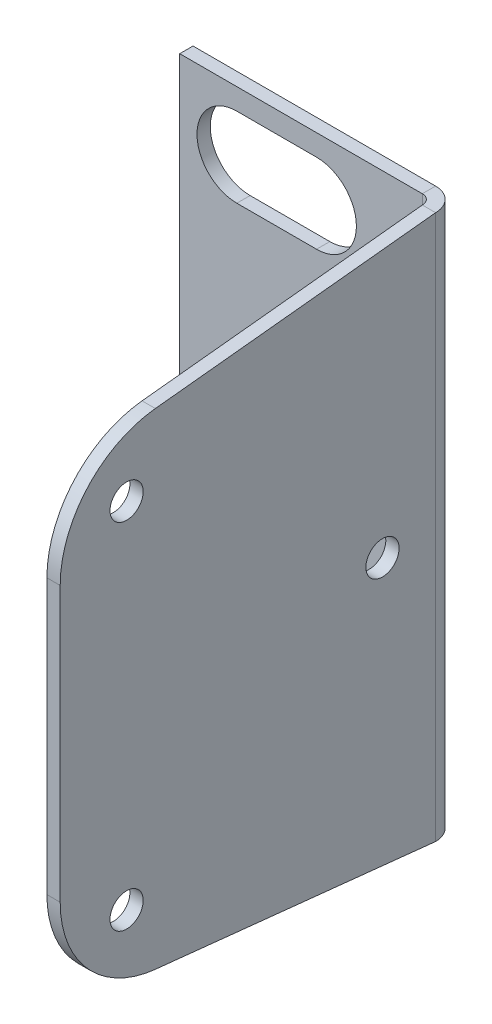
ISO-10303-21;
HEADER;
FILE_DESCRIPTION(('STEP AP214'),'2;1');
FILE_NAME('part.step','',(''),(''),'','','');
FILE_SCHEMA(('AUTOMOTIVE_DESIGN { 1 0 10303 214 1 1 1 1 }'));
ENDSEC;
DATA;
#1=APPLICATION_CONTEXT('core data for automotive mechanical design processes');
#2=APPLICATION_PROTOCOL_DEFINITION('international standard','automotive_design',2000,#1);
#3=PRODUCT_CONTEXT('',#1,'mechanical');
#4=PRODUCT('Part','Part','',(#3));
#5=PRODUCT_RELATED_PRODUCT_CATEGORY('part','',(#4));
#6=PRODUCT_DEFINITION_FORMATION('','',#4);
#7=PRODUCT_DEFINITION_CONTEXT('part definition',#1,'design');
#8=PRODUCT_DEFINITION('design','',#6,#7);
#9=PRODUCT_DEFINITION_SHAPE('','',#8);
#10=(LENGTH_UNIT() NAMED_UNIT(*) SI_UNIT(.MILLI.,.METRE.));
#11=(NAMED_UNIT(*) PLANE_ANGLE_UNIT() SI_UNIT($,.RADIAN.));
#12=(NAMED_UNIT(*) SI_UNIT($,.STERADIAN.) SOLID_ANGLE_UNIT());
#13=UNCERTAINTY_MEASURE_WITH_UNIT(LENGTH_MEASURE(1.E-05),#10,'distance_accuracy_value','');
#14=(GEOMETRIC_REPRESENTATION_CONTEXT(3) GLOBAL_UNCERTAINTY_ASSIGNED_CONTEXT((#13)) GLOBAL_UNIT_ASSIGNED_CONTEXT((#10,
#11,#12)) REPRESENTATION_CONTEXT('',''));
#15=CARTESIAN_POINT('',(0.,0.,0.));
#16=DIRECTION('',(0.,0.,1.));
#17=DIRECTION('',(1.,0.,0.));
#18=AXIS2_PLACEMENT_3D('',#15,#16,#17);
#19=CARTESIAN_POINT('',(-219.800000000025,0.,8.37981004221973E-13));
#20=DIRECTION('',(-1.,0.,0.));
#21=DIRECTION('',(0.,0.,1.));
#22=AXIS2_PLACEMENT_3D('',#19,#20,#21);
#23=PLANE('',#22);
#24=CARTESIAN_POINT('',(-219.800000000025,0.,5.7366));
#25=DIRECTION('',(-1.,0.,0.));
#26=DIRECTION('',(0.,0.,1.));
#27=AXIS2_PLACEMENT_3D('',#24,#25,#26);
#28=CIRCLE('',#27,1.25);
#29=CARTESIAN_POINT('',(-219.800000000025,0.,6.9866));
#30=VERTEX_POINT('',#29);
#31=EDGE_CURVE('E472',#30,#30,#28,.T.);
#32=ORIENTED_EDGE('',*,*,#31,.T.);
#33=EDGE_LOOP('',(#32));
#34=FACE_BOUND('',#33,.T.);
#35=CARTESIAN_POINT('',(-219.800000000024,13.3261646026093,25.));
#36=DIRECTION('',(-1.,0.,0.));
#37=DIRECTION('',(0.,0.,1.));
#38=AXIS2_PLACEMENT_3D('',#35,#36,#37);
#39=CIRCLE('',#38,1.25);
#40=CARTESIAN_POINT('',(-219.800000000024,13.3261646026093,26.25));
#41=VERTEX_POINT('',#40);
#42=EDGE_CURVE('E482',#41,#41,#39,.T.);
#43=ORIENTED_EDGE('',*,*,#42,.T.);
#44=EDGE_LOOP('',(#43));
#45=FACE_BOUND('',#44,.T.);
#46=CARTESIAN_POINT('',(-219.800000000024,-13.3261646026093,25.));
#47=DIRECTION('',(-1.,0.,0.));
#48=DIRECTION('',(0.,0.,1.));
#49=AXIS2_PLACEMENT_3D('',#46,#47,#48);
#50=CIRCLE('',#49,1.25);
#51=CARTESIAN_POINT('',(-219.800000000024,-13.3261646026093,26.25));
#52=VERTEX_POINT('',#51);
#53=EDGE_CURVE('E215',#52,#52,#50,.T.);
#54=ORIENTED_EDGE('',*,*,#53,.T.);
#55=EDGE_LOOP('',(#54));
#56=FACE_BOUND('',#55,.T.);
#57=DIRECTION('',(0.,-0.104528463267654,0.994521895368273));
#58=VECTOR('',#57,1.);
#59=CARTESIAN_POINT('',(-219.800000000025,20.4999999999999,1.7366));
#60=LINE('',#59,#58);
#61=CARTESIAN_POINT('',(-219.800000000025,20.4999999999999,1.7366));
#62=VERTEX_POINT('',#61);
#63=CARTESIAN_POINT('',(-219.800000000025,18.2823397655555,22.8362277061412));
#64=VERTEX_POINT('',#63);
#65=EDGE_CURVE('E298',#62,#64,#60,.T.);
#66=ORIENTED_EDGE('',*,*,#65,.T.);
#67=CARTESIAN_POINT('',(-219.800000000025,10.3261646026093,22.));
#68=DIRECTION('',(-1.,0.,0.));
#69=DIRECTION('',(0.,0.,1.));
#70=AXIS2_PLACEMENT_3D('',#67,#68,#69);
#71=CIRCLE('',#70,8.);
#72=CARTESIAN_POINT('',(-219.800000000025,10.3261646026093,30.));
#73=VERTEX_POINT('',#72);
#74=EDGE_CURVE('E287',#64,#73,#71,.F.);
#75=ORIENTED_EDGE('',*,*,#74,.T.);
#76=DIRECTION('',(0.,-1.,0.));
#77=VECTOR('',#76,1.);
#78=CARTESIAN_POINT('',(-219.800000000025,0.,30.));
#79=LINE('',#78,#77);
#80=CARTESIAN_POINT('',(-219.800000000025,-10.3261646026093,30.));
#81=VERTEX_POINT('',#80);
#82=EDGE_CURVE('E309',#73,#81,#79,.T.);
#83=ORIENTED_EDGE('',*,*,#82,.T.);
#84=CARTESIAN_POINT('',(-219.800000000025,-10.3261646026093,22.));
#85=DIRECTION('',(1.,0.,0.));
#86=DIRECTION('',(0.,0.,1.));
#87=AXIS2_PLACEMENT_3D('',#84,#85,#86);
#88=CIRCLE('',#87,8.);
#89=CARTESIAN_POINT('',(-219.800000000025,-18.2823397655554,22.8362277061412));
#90=VERTEX_POINT('',#89);
#91=EDGE_CURVE('E223',#90,#81,#88,.F.);
#92=ORIENTED_EDGE('',*,*,#91,.F.);
#93=DIRECTION('',(0.,0.104528463267654,0.994521895368273));
#94=VECTOR('',#93,1.);
#95=CARTESIAN_POINT('',(-219.800000000025,-20.4999999999999,1.7366));
#96=LINE('',#95,#94);
#97=CARTESIAN_POINT('',(-219.800000000025,-20.4999999999999,1.7366));
#98=VERTEX_POINT('',#97);
#99=EDGE_CURVE('E234',#98,#90,#96,.T.);
#100=ORIENTED_EDGE('',*,*,#99,.F.);
#101=DIRECTION('',(0.,1.,0.));
#102=VECTOR('',#101,1.);
#103=CARTESIAN_POINT('',(-219.800000000025,0.,1.7366));
#104=LINE('',#103,#102);
#105=EDGE_CURVE('E314',#62,#98,#104,.F.);
#106=ORIENTED_EDGE('',*,*,#105,.F.);
#107=EDGE_LOOP('',(#66,#75,#83,#92,#100,#106));
#108=FACE_BOUND('',#107,.T.);
#109=ADVANCED_FACE('F57',(#34,#45,#56,#108),#23,.F.);
#110=CARTESIAN_POINT('',(-220.800000000025,0.,8.41472485560817E-13));
#111=DIRECTION('',(-1.,0.,0.));
#112=DIRECTION('',(0.,0.,1.));
#113=AXIS2_PLACEMENT_3D('',#110,#111,#112);
#114=PLANE('',#113);
#115=CARTESIAN_POINT('',(-220.800000000025,0.,5.7366));
#116=DIRECTION('',(-1.,0.,0.));
#117=DIRECTION('',(0.,0.,1.));
#118=AXIS2_PLACEMENT_3D('',#115,#116,#117);
#119=CIRCLE('',#118,1.24999999999999);
#120=CARTESIAN_POINT('',(-220.800000000025,0.,6.98659999999999));
#121=VERTEX_POINT('',#120);
#122=EDGE_CURVE('E475',#121,#121,#119,.T.);
#123=ORIENTED_EDGE('',*,*,#122,.F.);
#124=EDGE_LOOP('',(#123));
#125=FACE_BOUND('',#124,.T.);
#126=CARTESIAN_POINT('',(-220.800000000025,13.3261646026093,25.));
#127=DIRECTION('',(-1.,0.,0.));
#128=DIRECTION('',(0.,0.,1.));
#129=AXIS2_PLACEMENT_3D('',#126,#127,#128);
#130=CIRCLE('',#129,1.24999999999999);
#131=CARTESIAN_POINT('',(-220.800000000025,13.3261646026093,26.25));
#132=VERTEX_POINT('',#131);
#133=EDGE_CURVE('E477',#132,#132,#130,.T.);
#134=ORIENTED_EDGE('',*,*,#133,.F.);
#135=EDGE_LOOP('',(#134));
#136=FACE_BOUND('',#135,.T.);
#137=CARTESIAN_POINT('',(-220.800000000025,-13.3261646026093,25.));
#138=DIRECTION('',(-1.,0.,0.));
#139=DIRECTION('',(0.,0.,1.));
#140=AXIS2_PLACEMENT_3D('',#137,#138,#139);
#141=CIRCLE('',#140,1.24999999999999);
#142=CARTESIAN_POINT('',(-220.800000000025,-13.3261646026093,26.25));
#143=VERTEX_POINT('',#142);
#144=EDGE_CURVE('E485',#143,#143,#141,.T.);
#145=ORIENTED_EDGE('',*,*,#144,.F.);
#146=EDGE_LOOP('',(#145));
#147=FACE_BOUND('',#146,.T.);
#148=CARTESIAN_POINT('',(-220.800000000025,10.3261646026093,22.));
#149=DIRECTION('',(-1.,0.,0.));
#150=DIRECTION('',(0.,0.,1.));
#151=AXIS2_PLACEMENT_3D('',#148,#149,#150);
#152=CIRCLE('',#151,8.);
#153=CARTESIAN_POINT('',(-220.800000000025,18.2823397655555,22.8362277061412));
#154=VERTEX_POINT('',#153);
#155=CARTESIAN_POINT('',(-220.800000000025,10.3261646026093,30.));
#156=VERTEX_POINT('',#155);
#157=EDGE_CURVE('E296',#154,#156,#152,.F.);
#158=ORIENTED_EDGE('',*,*,#157,.F.);
#159=DIRECTION('',(0.,-0.104528463267654,0.994521895368273));
#160=VECTOR('',#159,1.);
#161=CARTESIAN_POINT('',(-220.800000000025,20.4999999999999,1.7366));
#162=LINE('',#161,#160);
#163=CARTESIAN_POINT('',(-220.800000000025,20.4999999999999,1.7366));
#164=VERTEX_POINT('',#163);
#165=EDGE_CURVE('E293',#164,#154,#162,.T.);
#166=ORIENTED_EDGE('',*,*,#165,.F.);
#167=DIRECTION('',(0.,1.,0.));
#168=VECTOR('',#167,1.);
#169=CARTESIAN_POINT('',(-220.800000000025,0.,1.7366));
#170=LINE('',#169,#168);
#171=CARTESIAN_POINT('',(-220.800000000025,-20.4999999999999,1.7366));
#172=VERTEX_POINT('',#171);
#173=EDGE_CURVE('E306',#172,#164,#170,.T.);
#174=ORIENTED_EDGE('',*,*,#173,.F.);
#175=DIRECTION('',(0.,0.104528463267654,0.994521895368273));
#176=VECTOR('',#175,1.);
#177=CARTESIAN_POINT('',(-220.800000000025,-20.4999999999999,1.7366));
#178=LINE('',#177,#176);
#179=CARTESIAN_POINT('',(-220.800000000025,-18.2823397655554,22.8362277061412));
#180=VERTEX_POINT('',#179);
#181=EDGE_CURVE('E227',#172,#180,#178,.T.);
#182=ORIENTED_EDGE('',*,*,#181,.T.);
#183=CARTESIAN_POINT('',(-220.800000000025,-10.3261646026093,22.));
#184=DIRECTION('',(1.,0.,0.));
#185=DIRECTION('',(0.,0.,1.));
#186=AXIS2_PLACEMENT_3D('',#183,#184,#185);
#187=CIRCLE('',#186,8.);
#188=CARTESIAN_POINT('',(-220.800000000025,-10.3261646026093,30.));
#189=VERTEX_POINT('',#188);
#190=EDGE_CURVE('E231',#180,#189,#187,.F.);
#191=ORIENTED_EDGE('',*,*,#190,.T.);
#192=DIRECTION('',(0.,1.,0.));
#193=VECTOR('',#192,1.);
#194=CARTESIAN_POINT('',(-220.800000000025,0.,30.));
#195=LINE('',#194,#193);
#196=EDGE_CURVE('E312',#156,#189,#195,.F.);
#197=ORIENTED_EDGE('',*,*,#196,.F.);
#198=EDGE_LOOP('',(#158,#166,#174,#182,#191,#197));
#199=FACE_BOUND('',#198,.T.);
#200=ADVANCED_FACE('F369',(#125,#136,#147,#199),#114,.T.);
#201=CARTESIAN_POINT('',(-239.8,20.4999999999999,1.));
#202=DIRECTION('',(0.,-1.,0.));
#203=DIRECTION('',(0.,0.,-1.));
#204=AXIS2_PLACEMENT_3D('',#201,#202,#203);
#205=PLANE('',#204);
#206=DIRECTION('',(0.,0.,-1.));
#207=VECTOR('',#206,1.);
#208=CARTESIAN_POINT('',(-221.536600000025,20.4999999999999,1.));
#209=LINE('',#208,#207);
#210=CARTESIAN_POINT('',(-221.536600000025,20.4999999999999,1.));
#211=VERTEX_POINT('',#210);
#212=CARTESIAN_POINT('',(-221.536600000025,20.4999999999999,0.));
#213=VERTEX_POINT('',#212);
#214=EDGE_CURVE('E323',#211,#213,#209,.T.);
#215=ORIENTED_EDGE('',*,*,#214,.T.);
#216=DIRECTION('',(-1.,0.,0.));
#217=VECTOR('',#216,1.);
#218=CARTESIAN_POINT('',(-239.8,20.4999999999999,0.));
#219=LINE('',#218,#217);
#220=CARTESIAN_POINT('',(-239.8,20.4999999999999,0.));
#221=VERTEX_POINT('',#220);
#222=EDGE_CURVE('E335',#213,#221,#219,.T.);
#223=ORIENTED_EDGE('',*,*,#222,.T.);
#224=DIRECTION('',(0.,0.,-1.));
#225=VECTOR('',#224,1.);
#226=CARTESIAN_POINT('',(-239.8,20.4999999999999,1.));
#227=LINE('',#226,#225);
#228=CARTESIAN_POINT('',(-239.8,20.4999999999999,1.));
#229=VERTEX_POINT('',#228);
#230=EDGE_CURVE('E13',#229,#221,#227,.T.);
#231=ORIENTED_EDGE('',*,*,#230,.F.);
#232=DIRECTION('',(-1.,0.,0.));
#233=VECTOR('',#232,1.);
#234=CARTESIAN_POINT('',(-239.8,20.4999999999999,1.));
#235=LINE('',#234,#233);
#236=EDGE_CURVE('E65',#211,#229,#235,.T.);
#237=ORIENTED_EDGE('',*,*,#236,.F.);
#238=EDGE_LOOP('',(#215,#223,#231,#237));
#239=FACE_BOUND('',#238,.T.);
#240=ADVANCED_FACE('F340',(#239),#205,.F.);
#241=CARTESIAN_POINT('',(0.,0.,1.));
#242=DIRECTION('',(0.,0.,1.));
#243=DIRECTION('',(1.,0.,0.));
#244=AXIS2_PLACEMENT_3D('',#241,#242,#243);
#245=PLANE('',#244);
#246=CARTESIAN_POINT('',(-229.5,15.9,1.));
#247=DIRECTION('',(0.,0.,1.));
#248=DIRECTION('',(1.,0.,0.));
#249=AXIS2_PLACEMENT_3D('',#246,#247,#248);
#250=CIRCLE('',#249,3.);
#251=CARTESIAN_POINT('',(-229.5,12.9,1.));
#252=VERTEX_POINT('',#251);
#253=CARTESIAN_POINT('',(-229.5,18.9,1.));
#254=VERTEX_POINT('',#253);
#255=EDGE_CURVE('E72',#252,#254,#250,.T.);
#256=ORIENTED_EDGE('',*,*,#255,.F.);
#257=DIRECTION('',(1.,0.,0.));
#258=VECTOR('',#257,1.);
#259=CARTESIAN_POINT('',(-235.5,12.9,1.));
#260=LINE('',#259,#258);
#261=CARTESIAN_POINT('',(-235.5,12.9,1.));
#262=VERTEX_POINT('',#261);
#263=EDGE_CURVE('E268',#262,#252,#260,.T.);
#264=ORIENTED_EDGE('',*,*,#263,.F.);
#265=CARTESIAN_POINT('',(-235.5,15.9,1.));
#266=DIRECTION('',(0.,0.,1.));
#267=DIRECTION('',(1.,0.,0.));
#268=AXIS2_PLACEMENT_3D('',#265,#266,#267);
#269=CIRCLE('',#268,3.);
#270=CARTESIAN_POINT('',(-235.5,18.9,1.));
#271=VERTEX_POINT('',#270);
#272=EDGE_CURVE('E280',#271,#262,#269,.T.);
#273=ORIENTED_EDGE('',*,*,#272,.F.);
#274=DIRECTION('',(-1.,0.,0.));
#275=VECTOR('',#274,1.);
#276=CARTESIAN_POINT('',(-229.5,18.9,1.));
#277=LINE('',#276,#275);
#278=EDGE_CURVE('E277',#254,#271,#277,.T.);
#279=ORIENTED_EDGE('',*,*,#278,.F.);
#280=EDGE_LOOP('',(#256,#264,#273,#279));
#281=FACE_BOUND('',#280,.T.);
#282=DIRECTION('',(0.,-1.,0.));
#283=VECTOR('',#282,1.);
#284=CARTESIAN_POINT('',(-239.8,20.4999999999999,1.));
#285=LINE('',#284,#283);
#286=CARTESIAN_POINT('',(-239.8,-20.4999999999999,1.));
#287=VERTEX_POINT('',#286);
#288=EDGE_CURVE('E333',#229,#287,#285,.T.);
#289=ORIENTED_EDGE('',*,*,#288,.T.);
#290=DIRECTION('',(-1.,0.,0.));
#291=VECTOR('',#290,1.);
#292=CARTESIAN_POINT('',(-239.8,-20.4999999999999,1.));
#293=LINE('',#292,#291);
#294=CARTESIAN_POINT('',(-221.536600000025,-20.4999999999999,1.));
#295=VERTEX_POINT('',#294);
#296=EDGE_CURVE('E256',#295,#287,#293,.T.);
#297=ORIENTED_EDGE('',*,*,#296,.F.);
#298=DIRECTION('',(0.,1.,0.));
#299=VECTOR('',#298,1.);
#300=CARTESIAN_POINT('',(-221.536600000025,20.4999999999999,1.));
#301=LINE('',#300,#299);
#302=EDGE_CURVE('E327',#211,#295,#301,.F.);
#303=ORIENTED_EDGE('',*,*,#302,.F.);
#304=ORIENTED_EDGE('',*,*,#236,.T.);
#305=EDGE_LOOP('',(#289,#297,#303,#304));
#306=FACE_BOUND('',#305,.T.);
#307=CARTESIAN_POINT('',(-229.5,-15.8999999999999,1.));
#308=DIRECTION('',(0.,0.,-1.));
#309=DIRECTION('',(1.,0.,0.));
#310=AXIS2_PLACEMENT_3D('',#307,#308,#309);
#311=CIRCLE('',#310,3.);
#312=CARTESIAN_POINT('',(-229.5,-12.8999999999999,1.));
#313=VERTEX_POINT('',#312);
#314=CARTESIAN_POINT('',(-229.5,-18.8999999999999,1.));
#315=VERTEX_POINT('',#314);
#316=EDGE_CURVE('E213',#313,#315,#311,.T.);
#317=ORIENTED_EDGE('',*,*,#316,.T.);
#318=DIRECTION('',(-1.,0.,0.));
#319=VECTOR('',#318,1.);
#320=CARTESIAN_POINT('',(-229.5,-18.8999999999999,1.));
#321=LINE('',#320,#319);
#322=CARTESIAN_POINT('',(-235.5,-18.8999999999999,1.));
#323=VERTEX_POINT('',#322);
#324=EDGE_CURVE('E189',#315,#323,#321,.T.);
#325=ORIENTED_EDGE('',*,*,#324,.T.);
#326=CARTESIAN_POINT('',(-235.5,-15.8999999999999,1.));
#327=DIRECTION('',(0.,0.,-1.));
#328=DIRECTION('',(1.,0.,0.));
#329=AXIS2_PLACEMENT_3D('',#326,#327,#328);
#330=CIRCLE('',#329,3.);
#331=CARTESIAN_POINT('',(-235.5,-12.8999999999999,1.));
#332=VERTEX_POINT('',#331);
#333=EDGE_CURVE('E217',#323,#332,#330,.T.);
#334=ORIENTED_EDGE('',*,*,#333,.T.);
#335=DIRECTION('',(1.,0.,0.));
#336=VECTOR('',#335,1.);
#337=CARTESIAN_POINT('',(-235.5,-12.8999999999999,1.));
#338=LINE('',#337,#336);
#339=EDGE_CURVE('E203',#332,#313,#338,.T.);
#340=ORIENTED_EDGE('',*,*,#339,.T.);
#341=EDGE_LOOP('',(#317,#325,#334,#340));
#342=FACE_BOUND('',#341,.T.);
#343=ADVANCED_FACE('F355',(#281,#306,#342),#245,.T.);
#344=CARTESIAN_POINT('',(0.,0.,0.));
#345=DIRECTION('',(0.,0.,1.));
#346=DIRECTION('',(1.,0.,0.));
#347=AXIS2_PLACEMENT_3D('',#344,#345,#346);
#348=PLANE('',#347);
#349=DIRECTION('',(1.,0.,0.));
#350=VECTOR('',#349,1.);
#351=CARTESIAN_POINT('',(-235.5,12.9,0.));
#352=LINE('',#351,#350);
#353=CARTESIAN_POINT('',(-235.5,12.9,0.));
#354=VERTEX_POINT('',#353);
#355=CARTESIAN_POINT('',(-229.5,12.9,0.));
#356=VERTEX_POINT('',#355);
#357=EDGE_CURVE('E272',#354,#356,#352,.T.);
#358=ORIENTED_EDGE('',*,*,#357,.T.);
#359=CARTESIAN_POINT('',(-229.5,15.9,0.));
#360=DIRECTION('',(0.,0.,1.));
#361=DIRECTION('',(1.,0.,0.));
#362=AXIS2_PLACEMENT_3D('',#359,#360,#361);
#363=CIRCLE('',#362,3.);
#364=CARTESIAN_POINT('',(-229.5,18.9,0.));
#365=VERTEX_POINT('',#364);
#366=EDGE_CURVE('E264',#356,#365,#363,.T.);
#367=ORIENTED_EDGE('',*,*,#366,.T.);
#368=DIRECTION('',(-1.,0.,0.));
#369=VECTOR('',#368,1.);
#370=CARTESIAN_POINT('',(-229.5,18.9,0.));
#371=LINE('',#370,#369);
#372=CARTESIAN_POINT('',(-235.5,18.9,0.));
#373=VERTEX_POINT('',#372);
#374=EDGE_CURVE('E267',#365,#373,#371,.T.);
#375=ORIENTED_EDGE('',*,*,#374,.T.);
#376=CARTESIAN_POINT('',(-235.5,15.9,0.));
#377=DIRECTION('',(0.,0.,1.));
#378=DIRECTION('',(1.,0.,0.));
#379=AXIS2_PLACEMENT_3D('',#376,#377,#378);
#380=CIRCLE('',#379,3.);
#381=EDGE_CURVE('E80',#373,#354,#380,.T.);
#382=ORIENTED_EDGE('',*,*,#381,.T.);
#383=EDGE_LOOP('',(#358,#367,#375,#382));
#384=FACE_BOUND('',#383,.T.);
#385=DIRECTION('',(0.,1.,0.));
#386=VECTOR('',#385,1.);
#387=CARTESIAN_POINT('',(-221.536600000025,20.4999999999999,0.));
#388=LINE('',#387,#386);
#389=CARTESIAN_POINT('',(-221.536600000025,-20.4999999999999,0.));
#390=VERTEX_POINT('',#389);
#391=EDGE_CURVE('E321',#213,#390,#388,.F.);
#392=ORIENTED_EDGE('',*,*,#391,.T.);
#393=DIRECTION('',(-1.,0.,0.));
#394=VECTOR('',#393,1.);
#395=CARTESIAN_POINT('',(-239.8,-20.4999999999999,0.));
#396=LINE('',#395,#394);
#397=CARTESIAN_POINT('',(-239.8,-20.4999999999999,0.));
#398=VERTEX_POINT('',#397);
#399=EDGE_CURVE('E255',#390,#398,#396,.T.);
#400=ORIENTED_EDGE('',*,*,#399,.T.);
#401=DIRECTION('',(0.,-1.,0.));
#402=VECTOR('',#401,1.);
#403=CARTESIAN_POINT('',(-239.8,20.4999999999999,0.));
#404=LINE('',#403,#402);
#405=EDGE_CURVE('E332',#221,#398,#404,.T.);
#406=ORIENTED_EDGE('',*,*,#405,.F.);
#407=ORIENTED_EDGE('',*,*,#222,.F.);
#408=EDGE_LOOP('',(#392,#400,#406,#407));
#409=FACE_BOUND('',#408,.T.);
#410=DIRECTION('',(1.,0.,0.));
#411=VECTOR('',#410,1.);
#412=CARTESIAN_POINT('',(-235.5,-12.8999999999999,0.));
#413=LINE('',#412,#411);
#414=CARTESIAN_POINT('',(-235.5,-12.8999999999999,0.));
#415=VERTEX_POINT('',#414);
#416=CARTESIAN_POINT('',(-229.5,-12.8999999999999,0.));
#417=VERTEX_POINT('',#416);
#418=EDGE_CURVE('E194',#415,#417,#413,.T.);
#419=ORIENTED_EDGE('',*,*,#418,.F.);
#420=CARTESIAN_POINT('',(-235.5,-15.8999999999999,0.));
#421=DIRECTION('',(0.,0.,-1.));
#422=DIRECTION('',(1.,0.,0.));
#423=AXIS2_PLACEMENT_3D('',#420,#421,#422);
#424=CIRCLE('',#423,3.);
#425=CARTESIAN_POINT('',(-235.5,-18.8999999999999,0.));
#426=VERTEX_POINT('',#425);
#427=EDGE_CURVE('E207',#426,#415,#424,.T.);
#428=ORIENTED_EDGE('',*,*,#427,.F.);
#429=DIRECTION('',(-1.,0.,0.));
#430=VECTOR('',#429,1.);
#431=CARTESIAN_POINT('',(-229.5,-18.8999999999999,0.));
#432=LINE('',#431,#430);
#433=CARTESIAN_POINT('',(-229.5,-18.8999999999999,0.));
#434=VERTEX_POINT('',#433);
#435=EDGE_CURVE('E186',#434,#426,#432,.T.);
#436=ORIENTED_EDGE('',*,*,#435,.F.);
#437=CARTESIAN_POINT('',(-229.5,-15.8999999999999,0.));
#438=DIRECTION('',(0.,0.,-1.));
#439=DIRECTION('',(1.,0.,0.));
#440=AXIS2_PLACEMENT_3D('',#437,#438,#439);
#441=CIRCLE('',#440,3.);
#442=EDGE_CURVE('E197',#417,#434,#441,.T.);
#443=ORIENTED_EDGE('',*,*,#442,.F.);
#444=EDGE_LOOP('',(#419,#428,#436,#443));
#445=FACE_BOUND('',#444,.T.);
#446=ADVANCED_FACE('F205',(#384,#409,#445),#348,.F.);
#447=CARTESIAN_POINT('',(-239.8,20.4999999999999,1.));
#448=DIRECTION('',(1.,0.,0.));
#449=DIRECTION('',(0.,0.,-1.));
#450=AXIS2_PLACEMENT_3D('',#447,#448,#449);
#451=PLANE('',#450);
#452=ORIENTED_EDGE('',*,*,#405,.T.);
#453=DIRECTION('',(0.,0.,-1.));
#454=VECTOR('',#453,1.);
#455=CARTESIAN_POINT('',(-239.8,-20.4999999999999,1.));
#456=LINE('',#455,#454);
#457=EDGE_CURVE('E259',#287,#398,#456,.T.);
#458=ORIENTED_EDGE('',*,*,#457,.F.);
#459=ORIENTED_EDGE('',*,*,#288,.F.);
#460=ORIENTED_EDGE('',*,*,#230,.T.);
#461=EDGE_LOOP('',(#452,#458,#459,#460));
#462=FACE_BOUND('',#461,.T.);
#463=ADVANCED_FACE('F59',(#462),#451,.F.);
#464=CARTESIAN_POINT('',(-221.536600000025,20.4999999999999,1.73660000000001));
#465=DIRECTION('',(0.,-1.,0.));
#466=DIRECTION('',(0.,0.,-1.));
#467=AXIS2_PLACEMENT_3D('',#464,#465,#466);
#468=PLANE('',#467);
#469=CARTESIAN_POINT('',(-221.536600000025,20.4999999999999,1.73660000000001));
#470=DIRECTION('',(0.,1.,0.));
#471=DIRECTION('',(0.,0.,1.));
#472=AXIS2_PLACEMENT_3D('',#469,#470,#471);
#473=CIRCLE('',#472,0.736600000000004);
#474=EDGE_CURVE('E311',#164,#211,#473,.T.);
#475=ORIENTED_EDGE('',*,*,#474,.F.);
#476=DIRECTION('',(-1.,0.,0.));
#477=VECTOR('',#476,1.);
#478=CARTESIAN_POINT('',(-220.800000000025,20.4999999999999,1.7366));
#479=LINE('',#478,#477);
#480=EDGE_CURVE('E316',#164,#62,#479,.F.);
#481=ORIENTED_EDGE('',*,*,#480,.T.);
#482=CARTESIAN_POINT('',(-221.536600000025,20.4999999999999,1.73660000000001));
#483=DIRECTION('',(0.,1.,0.));
#484=DIRECTION('',(0.,0.,1.));
#485=AXIS2_PLACEMENT_3D('',#482,#483,#484);
#486=CIRCLE('',#485,1.7366);
#487=EDGE_CURVE('E324',#62,#213,#486,.T.);
#488=ORIENTED_EDGE('',*,*,#487,.T.);
#489=ORIENTED_EDGE('',*,*,#214,.F.);
#490=EDGE_LOOP('',(#475,#481,#488,#489));
#491=FACE_BOUND('',#490,.T.);
#492=ADVANCED_FACE('F359',(#491),#468,.F.);
#493=CARTESIAN_POINT('',(-221.536600000025,20.4999999999999,1.73660000000001));
#494=DIRECTION('',(0.,1.,0.));
#495=DIRECTION('',(1.,0.,0.));
#496=AXIS2_PLACEMENT_3D('',#493,#494,#495);
#497=CYLINDRICAL_SURFACE('',#496,1.7366);
#498=ORIENTED_EDGE('',*,*,#391,.F.);
#499=ORIENTED_EDGE('',*,*,#487,.F.);
#500=ORIENTED_EDGE('',*,*,#105,.T.);
#501=CARTESIAN_POINT('',(-221.536600000025,-20.4999999999999,1.73660000000001));
#502=DIRECTION('',(0.,1.,0.));
#503=DIRECTION('',(0.,0.,1.));
#504=AXIS2_PLACEMENT_3D('',#501,#502,#503);
#505=CIRCLE('',#504,1.7366);
#506=EDGE_CURVE('E247',#98,#390,#505,.T.);
#507=ORIENTED_EDGE('',*,*,#506,.T.);
#508=EDGE_LOOP('',(#498,#499,#500,#507));
#509=FACE_BOUND('',#508,.T.);
#510=ADVANCED_FACE('F393',(#509),#497,.T.);
#511=CARTESIAN_POINT('',(-221.536600000025,20.4999999999999,1.73660000000001));
#512=DIRECTION('',(0.,1.,0.));
#513=DIRECTION('',(1.,0.,0.));
#514=AXIS2_PLACEMENT_3D('',#511,#512,#513);
#515=CYLINDRICAL_SURFACE('',#514,0.736600000000004);
#516=ORIENTED_EDGE('',*,*,#302,.T.);
#517=CARTESIAN_POINT('',(-221.536600000025,-20.4999999999999,1.73660000000001));
#518=DIRECTION('',(0.,1.,0.));
#519=DIRECTION('',(0.,0.,1.));
#520=AXIS2_PLACEMENT_3D('',#517,#518,#519);
#521=CIRCLE('',#520,0.736600000000004);
#522=EDGE_CURVE('E246',#172,#295,#521,.T.);
#523=ORIENTED_EDGE('',*,*,#522,.F.);
#524=ORIENTED_EDGE('',*,*,#173,.T.);
#525=ORIENTED_EDGE('',*,*,#474,.T.);
#526=EDGE_LOOP('',(#516,#523,#524,#525));
#527=FACE_BOUND('',#526,.T.);
#528=ADVANCED_FACE('F362',(#527),#515,.F.);
#529=CARTESIAN_POINT('',(-219.800000000025,0.,30.));
#530=DIRECTION('',(0.,0.,-1.));
#531=DIRECTION('',(-1.,0.,0.));
#532=AXIS2_PLACEMENT_3D('',#529,#530,#531);
#533=PLANE('',#532);
#534=ORIENTED_EDGE('',*,*,#82,.F.);
#535=DIRECTION('',(1.,0.,0.));
#536=VECTOR('',#535,1.);
#537=CARTESIAN_POINT('',(-219.800000000025,10.3261646026093,30.));
#538=LINE('',#537,#536);
#539=EDGE_CURVE('E295',#73,#156,#538,.F.);
#540=ORIENTED_EDGE('',*,*,#539,.T.);
#541=ORIENTED_EDGE('',*,*,#196,.T.);
#542=DIRECTION('',(1.,0.,0.));
#543=VECTOR('',#542,1.);
#544=CARTESIAN_POINT('',(-219.800000000025,-10.3261646026093,30.));
#545=LINE('',#544,#543);
#546=EDGE_CURVE('E230',#81,#189,#545,.F.);
#547=ORIENTED_EDGE('',*,*,#546,.F.);
#548=EDGE_LOOP('',(#534,#540,#541,#547));
#549=FACE_BOUND('',#548,.T.);
#550=ADVANCED_FACE('F385',(#549),#533,.F.);
#551=CARTESIAN_POINT('',(-219.800000000025,20.4999999999999,1.7366));
#552=DIRECTION('',(0.,-0.994521895368273,-0.104528463267654));
#553=DIRECTION('',(0.,-0.104528463267654,0.994521895368273));
#554=AXIS2_PLACEMENT_3D('',#551,#552,#553);
#555=PLANE('',#554);
#556=DIRECTION('',(1.,0.,0.));
#557=VECTOR('',#556,1.);
#558=CARTESIAN_POINT('',(-219.800000000025,18.2823397655555,22.8362277061412));
#559=LINE('',#558,#557);
#560=EDGE_CURVE('E303',#64,#154,#559,.F.);
#561=ORIENTED_EDGE('',*,*,#560,.F.);
#562=ORIENTED_EDGE('',*,*,#65,.F.);
#563=ORIENTED_EDGE('',*,*,#480,.F.);
#564=ORIENTED_EDGE('',*,*,#165,.T.);
#565=EDGE_LOOP('',(#561,#562,#563,#564));
#566=FACE_BOUND('',#565,.T.);
#567=ADVANCED_FACE('F391',(#566),#555,.F.);
#568=CARTESIAN_POINT('',(-219.800000000025,10.3261646026093,22.));
#569=DIRECTION('',(-1.,0.,0.));
#570=DIRECTION('',(0.,0.,1.));
#571=AXIS2_PLACEMENT_3D('',#568,#569,#570);
#572=CYLINDRICAL_SURFACE('',#571,8.);
#573=ORIENTED_EDGE('',*,*,#74,.F.);
#574=ORIENTED_EDGE('',*,*,#560,.T.);
#575=ORIENTED_EDGE('',*,*,#157,.T.);
#576=ORIENTED_EDGE('',*,*,#539,.F.);
#577=EDGE_LOOP('',(#573,#574,#575,#576));
#578=FACE_BOUND('',#577,.T.);
#579=ADVANCED_FACE('F388',(#578),#572,.T.);
#580=CARTESIAN_POINT('',(-229.5,15.9,0.));
#581=DIRECTION('',(0.,0.,1.));
#582=DIRECTION('',(1.,0.,0.));
#583=AXIS2_PLACEMENT_3D('',#580,#581,#582);
#584=CYLINDRICAL_SURFACE('',#583,3.);
#585=ORIENTED_EDGE('',*,*,#255,.T.);
#586=DIRECTION('',(0.,0.,1.));
#587=VECTOR('',#586,1.);
#588=CARTESIAN_POINT('',(-229.5,18.9,0.));
#589=LINE('',#588,#587);
#590=EDGE_CURVE('E275',#365,#254,#589,.T.);
#591=ORIENTED_EDGE('',*,*,#590,.F.);
#592=ORIENTED_EDGE('',*,*,#366,.F.);
#593=DIRECTION('',(0.,0.,1.));
#594=VECTOR('',#593,1.);
#595=CARTESIAN_POINT('',(-229.5,12.9,0.));
#596=LINE('',#595,#594);
#597=EDGE_CURVE('E285',#356,#252,#596,.T.);
#598=ORIENTED_EDGE('',*,*,#597,.T.);
#599=EDGE_LOOP('',(#585,#591,#592,#598));
#600=FACE_BOUND('',#599,.T.);
#601=ADVANCED_FACE('F422',(#600),#584,.F.);
#602=CARTESIAN_POINT('',(-235.5,12.9,0.));
#603=DIRECTION('',(0.,-1.,0.));
#604=DIRECTION('',(1.,0.,0.));
#605=AXIS2_PLACEMENT_3D('',#602,#603,#604);
#606=PLANE('',#605);
#607=ORIENTED_EDGE('',*,*,#263,.T.);
#608=ORIENTED_EDGE('',*,*,#597,.F.);
#609=ORIENTED_EDGE('',*,*,#357,.F.);
#610=DIRECTION('',(0.,0.,1.));
#611=VECTOR('',#610,1.);
#612=CARTESIAN_POINT('',(-235.5,12.9,0.));
#613=LINE('',#612,#611);
#614=EDGE_CURVE('E288',#354,#262,#613,.T.);
#615=ORIENTED_EDGE('',*,*,#614,.T.);
#616=EDGE_LOOP('',(#607,#608,#609,#615));
#617=FACE_BOUND('',#616,.T.);
#618=ADVANCED_FACE('F426',(#617),#606,.F.);
#619=CARTESIAN_POINT('',(-235.5,15.9,0.));
#620=DIRECTION('',(0.,0.,1.));
#621=DIRECTION('',(1.,0.,0.));
#622=AXIS2_PLACEMENT_3D('',#619,#620,#621);
#623=CYLINDRICAL_SURFACE('',#622,3.);
#624=ORIENTED_EDGE('',*,*,#272,.T.);
#625=ORIENTED_EDGE('',*,*,#614,.F.);
#626=ORIENTED_EDGE('',*,*,#381,.F.);
#627=DIRECTION('',(0.,0.,1.));
#628=VECTOR('',#627,1.);
#629=CARTESIAN_POINT('',(-235.5,18.9,0.));
#630=LINE('',#629,#628);
#631=EDGE_CURVE('E290',#373,#271,#630,.T.);
#632=ORIENTED_EDGE('',*,*,#631,.T.);
#633=EDGE_LOOP('',(#624,#625,#626,#632));
#634=FACE_BOUND('',#633,.T.);
#635=ADVANCED_FACE('F430',(#634),#623,.F.);
#636=CARTESIAN_POINT('',(-229.5,18.9,0.));
#637=DIRECTION('',(0.,1.,0.));
#638=DIRECTION('',(-1.,0.,0.));
#639=AXIS2_PLACEMENT_3D('',#636,#637,#638);
#640=PLANE('',#639);
#641=ORIENTED_EDGE('',*,*,#278,.T.);
#642=ORIENTED_EDGE('',*,*,#631,.F.);
#643=ORIENTED_EDGE('',*,*,#374,.F.);
#644=ORIENTED_EDGE('',*,*,#590,.T.);
#645=EDGE_LOOP('',(#641,#642,#643,#644));
#646=FACE_BOUND('',#645,.T.);
#647=ADVANCED_FACE('F427',(#646),#640,.F.);
#648=CARTESIAN_POINT('',(-239.8,-20.4999999999999,1.));
#649=DIRECTION('',(0.,1.,0.));
#650=DIRECTION('',(0.,0.,-1.));
#651=AXIS2_PLACEMENT_3D('',#648,#649,#650);
#652=PLANE('',#651);
#653=DIRECTION('',(0.,0.,-1.));
#654=VECTOR('',#653,1.);
#655=CARTESIAN_POINT('',(-221.536600000025,-20.4999999999999,1.));
#656=LINE('',#655,#654);
#657=EDGE_CURVE('E250',#295,#390,#656,.T.);
#658=ORIENTED_EDGE('',*,*,#657,.F.);
#659=ORIENTED_EDGE('',*,*,#296,.T.);
#660=ORIENTED_EDGE('',*,*,#457,.T.);
#661=ORIENTED_EDGE('',*,*,#399,.F.);
#662=EDGE_LOOP('',(#658,#659,#660,#661));
#663=FACE_BOUND('',#662,.T.);
#664=ADVANCED_FACE('F352',(#663),#652,.F.);
#665=CARTESIAN_POINT('',(-221.536600000025,-20.4999999999999,1.73660000000001));
#666=DIRECTION('',(0.,1.,0.));
#667=DIRECTION('',(0.,0.,-1.));
#668=AXIS2_PLACEMENT_3D('',#665,#666,#667);
#669=PLANE('',#668);
#670=ORIENTED_EDGE('',*,*,#522,.T.);
#671=ORIENTED_EDGE('',*,*,#657,.T.);
#672=ORIENTED_EDGE('',*,*,#506,.F.);
#673=DIRECTION('',(-1.,0.,0.));
#674=VECTOR('',#673,1.);
#675=CARTESIAN_POINT('',(-220.800000000025,-20.4999999999999,1.7366));
#676=LINE('',#675,#674);
#677=EDGE_CURVE('E241',#172,#98,#676,.F.);
#678=ORIENTED_EDGE('',*,*,#677,.F.);
#679=EDGE_LOOP('',(#670,#671,#672,#678));
#680=FACE_BOUND('',#679,.T.);
#681=ADVANCED_FACE('F373',(#680),#669,.F.);
#682=CARTESIAN_POINT('',(-219.800000000025,-20.4999999999999,1.7366));
#683=DIRECTION('',(0.,0.994521895368273,-0.104528463267654));
#684=DIRECTION('',(0.,0.104528463267654,0.994521895368273));
#685=AXIS2_PLACEMENT_3D('',#682,#683,#684);
#686=PLANE('',#685);
#687=DIRECTION('',(1.,0.,0.));
#688=VECTOR('',#687,1.);
#689=CARTESIAN_POINT('',(-219.800000000025,-18.2823397655554,22.8362277061412));
#690=LINE('',#689,#688);
#691=EDGE_CURVE('E239',#90,#180,#690,.F.);
#692=ORIENTED_EDGE('',*,*,#691,.T.);
#693=ORIENTED_EDGE('',*,*,#181,.F.);
#694=ORIENTED_EDGE('',*,*,#677,.T.);
#695=ORIENTED_EDGE('',*,*,#99,.T.);
#696=EDGE_LOOP('',(#692,#693,#694,#695));
#697=FACE_BOUND('',#696,.T.);
#698=ADVANCED_FACE('F376',(#697),#686,.F.);
#699=CARTESIAN_POINT('',(-219.800000000025,-10.3261646026093,22.));
#700=DIRECTION('',(-1.,0.,0.));
#701=DIRECTION('',(0.,0.,1.));
#702=AXIS2_PLACEMENT_3D('',#699,#700,#701);
#703=CYLINDRICAL_SURFACE('',#702,8.);
#704=ORIENTED_EDGE('',*,*,#91,.T.);
#705=ORIENTED_EDGE('',*,*,#546,.T.);
#706=ORIENTED_EDGE('',*,*,#190,.F.);
#707=ORIENTED_EDGE('',*,*,#691,.F.);
#708=EDGE_LOOP('',(#704,#705,#706,#707));
#709=FACE_BOUND('',#708,.T.);
#710=ADVANCED_FACE('F379',(#709),#703,.T.);
#711=CARTESIAN_POINT('',(-229.5,-15.8999999999999,0.));
#712=DIRECTION('',(0.,0.,1.));
#713=DIRECTION('',(1.,0.,0.));
#714=AXIS2_PLACEMENT_3D('',#711,#712,#713);
#715=CYLINDRICAL_SURFACE('',#714,3.);
#716=ORIENTED_EDGE('',*,*,#316,.F.);
#717=DIRECTION('',(0.,0.,1.));
#718=VECTOR('',#717,1.);
#719=CARTESIAN_POINT('',(-229.5,-12.8999999999999,0.));
#720=LINE('',#719,#718);
#721=EDGE_CURVE('E199',#417,#313,#720,.T.);
#722=ORIENTED_EDGE('',*,*,#721,.F.);
#723=ORIENTED_EDGE('',*,*,#442,.T.);
#724=DIRECTION('',(0.,0.,1.));
#725=VECTOR('',#724,1.);
#726=CARTESIAN_POINT('',(-229.5,-18.8999999999999,0.));
#727=LINE('',#726,#725);
#728=EDGE_CURVE('E182',#434,#315,#727,.T.);
#729=ORIENTED_EDGE('',*,*,#728,.T.);
#730=EDGE_LOOP('',(#716,#722,#723,#729));
#731=FACE_BOUND('',#730,.T.);
#732=ADVANCED_FACE('F198',(#731),#715,.F.);
#733=CARTESIAN_POINT('',(-235.5,-12.8999999999999,0.));
#734=DIRECTION('',(0.,1.,0.));
#735=DIRECTION('',(1.,0.,0.));
#736=AXIS2_PLACEMENT_3D('',#733,#734,#735);
#737=PLANE('',#736);
#738=ORIENTED_EDGE('',*,*,#339,.F.);
#739=DIRECTION('',(0.,0.,1.));
#740=VECTOR('',#739,1.);
#741=CARTESIAN_POINT('',(-235.5,-12.8999999999999,0.));
#742=LINE('',#741,#740);
#743=EDGE_CURVE('E224',#415,#332,#742,.T.);
#744=ORIENTED_EDGE('',*,*,#743,.F.);
#745=ORIENTED_EDGE('',*,*,#418,.T.);
#746=ORIENTED_EDGE('',*,*,#721,.T.);
#747=EDGE_LOOP('',(#738,#744,#745,#746));
#748=FACE_BOUND('',#747,.T.);
#749=ADVANCED_FACE('F447',(#748),#737,.F.);
#750=CARTESIAN_POINT('',(-235.5,-15.8999999999999,0.));
#751=DIRECTION('',(0.,0.,1.));
#752=DIRECTION('',(1.,0.,0.));
#753=AXIS2_PLACEMENT_3D('',#750,#751,#752);
#754=CYLINDRICAL_SURFACE('',#753,3.);
#755=ORIENTED_EDGE('',*,*,#333,.F.);
#756=DIRECTION('',(0.,0.,1.));
#757=VECTOR('',#756,1.);
#758=CARTESIAN_POINT('',(-235.5,-18.8999999999999,0.));
#759=LINE('',#758,#757);
#760=EDGE_CURVE('E193',#426,#323,#759,.T.);
#761=ORIENTED_EDGE('',*,*,#760,.F.);
#762=ORIENTED_EDGE('',*,*,#427,.T.);
#763=ORIENTED_EDGE('',*,*,#743,.T.);
#764=EDGE_LOOP('',(#755,#761,#762,#763));
#765=FACE_BOUND('',#764,.T.);
#766=ADVANCED_FACE('F451',(#765),#754,.F.);
#767=CARTESIAN_POINT('',(-229.5,-18.8999999999999,0.));
#768=DIRECTION('',(0.,-1.,0.));
#769=DIRECTION('',(-1.,0.,0.));
#770=AXIS2_PLACEMENT_3D('',#767,#768,#769);
#771=PLANE('',#770);
#772=ORIENTED_EDGE('',*,*,#324,.F.);
#773=ORIENTED_EDGE('',*,*,#728,.F.);
#774=ORIENTED_EDGE('',*,*,#435,.T.);
#775=ORIENTED_EDGE('',*,*,#760,.T.);
#776=EDGE_LOOP('',(#772,#773,#774,#775));
#777=FACE_BOUND('',#776,.T.);
#778=ADVANCED_FACE('F184',(#777),#771,.F.);
#779=CARTESIAN_POINT('',(-220.800000000025,-13.3261646026093,25.));
#780=DIRECTION('',(-1.,0.,0.));
#781=DIRECTION('',(0.,0.,1.));
#782=AXIS2_PLACEMENT_3D('',#779,#780,#781);
#783=CYLINDRICAL_SURFACE('',#782,1.24999999999999);
#784=ORIENTED_EDGE('',*,*,#53,.F.);
#785=EDGE_LOOP('',(#784));
#786=FACE_BOUND('',#785,.T.);
#787=ORIENTED_EDGE('',*,*,#144,.T.);
#788=EDGE_LOOP('',(#787));
#789=FACE_BOUND('',#788,.T.);
#790=ADVANCED_FACE('F450',(#786,#789),#783,.F.);
#791=CARTESIAN_POINT('',(-220.800000000025,13.3261646026093,25.));
#792=DIRECTION('',(-1.,0.,0.));
#793=DIRECTION('',(0.,0.,1.));
#794=AXIS2_PLACEMENT_3D('',#791,#792,#793);
#795=CYLINDRICAL_SURFACE('',#794,1.24999999999999);
#796=ORIENTED_EDGE('',*,*,#42,.F.);
#797=EDGE_LOOP('',(#796));
#798=FACE_BOUND('',#797,.T.);
#799=ORIENTED_EDGE('',*,*,#133,.T.);
#800=EDGE_LOOP('',(#799));
#801=FACE_BOUND('',#800,.T.);
#802=ADVANCED_FACE('F460',(#798,#801),#795,.F.);
#803=CARTESIAN_POINT('',(-220.800000000025,0.,5.7366));
#804=DIRECTION('',(-1.,0.,0.));
#805=DIRECTION('',(0.,0.,1.));
#806=AXIS2_PLACEMENT_3D('',#803,#804,#805);
#807=CYLINDRICAL_SURFACE('',#806,1.24999999999999);
#808=ORIENTED_EDGE('',*,*,#31,.F.);
#809=EDGE_LOOP('',(#808));
#810=FACE_BOUND('',#809,.T.);
#811=ORIENTED_EDGE('',*,*,#122,.T.);
#812=EDGE_LOOP('',(#811));
#813=FACE_BOUND('',#812,.T.);
#814=ADVANCED_FACE('F464',(#810,#813),#807,.F.);
#815=CLOSED_SHELL('',(#109,#200,#240,#343,#446,#463,#492,#510,#528,#550,#567,#579,#601,#618,
#635,#647,#664,#681,#698,#710,#732,#749,#766,#778,#790,#802,#814));
#816=MANIFOLD_SOLID_BREP('B2',#815);
#817=ADVANCED_BREP_SHAPE_REPRESENTATION('',(#18,#816),#14);
#818=SHAPE_DEFINITION_REPRESENTATION(#9,#817);
ENDSEC;
END-ISO-10303-21;
